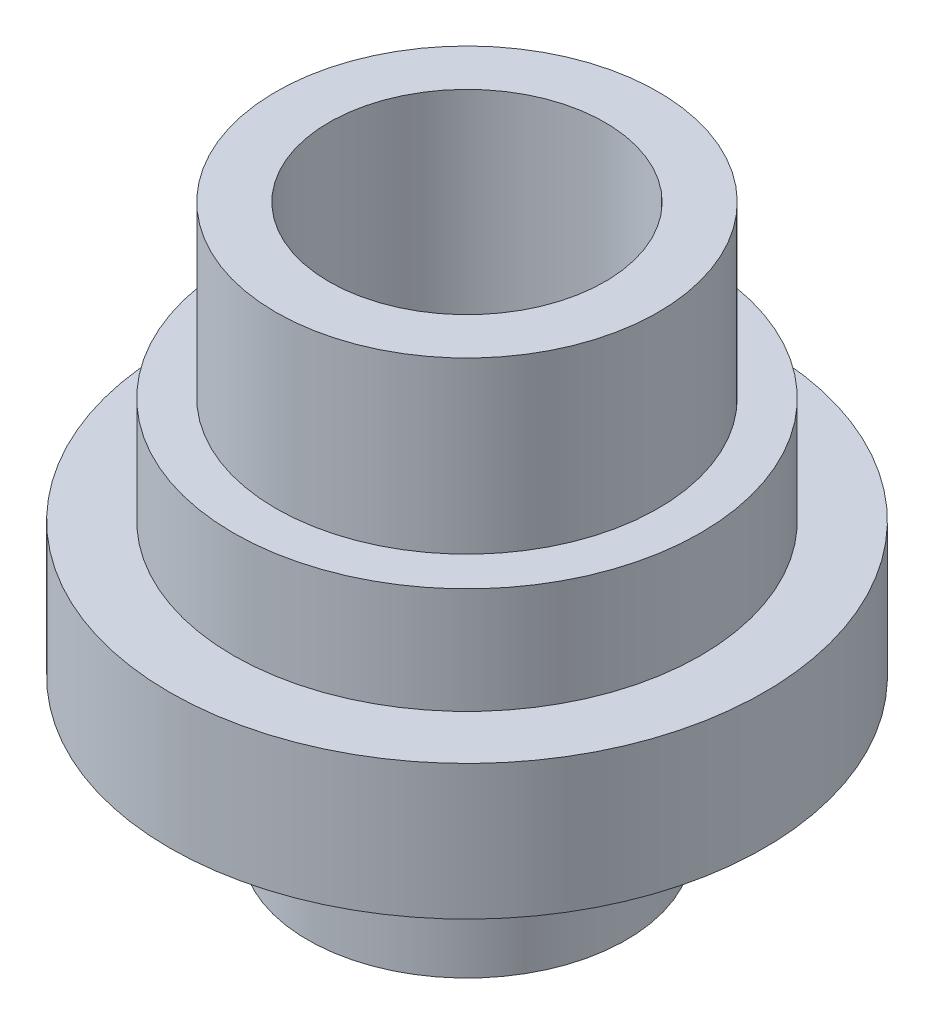
ISO-10303-21;
HEADER;
FILE_DESCRIPTION(('STEP AP214'),'2;1');
FILE_NAME('part.step','',(''),(''),'','','');
FILE_SCHEMA(('AUTOMOTIVE_DESIGN { 1 0 10303 214 1 1 1 1 }'));
ENDSEC;
DATA;
#1=APPLICATION_CONTEXT('core data for automotive mechanical design processes');
#2=APPLICATION_PROTOCOL_DEFINITION('international standard','automotive_design',2000,#1);
#3=PRODUCT_CONTEXT('',#1,'mechanical');
#4=PRODUCT('Part','Part','',(#3));
#5=PRODUCT_RELATED_PRODUCT_CATEGORY('part','',(#4));
#6=PRODUCT_DEFINITION_FORMATION('','',#4);
#7=PRODUCT_DEFINITION_CONTEXT('part definition',#1,'design');
#8=PRODUCT_DEFINITION('design','',#6,#7);
#9=PRODUCT_DEFINITION_SHAPE('','',#8);
#10=(LENGTH_UNIT() NAMED_UNIT(*) SI_UNIT(.MILLI.,.METRE.));
#11=(NAMED_UNIT(*) PLANE_ANGLE_UNIT() SI_UNIT($,.RADIAN.));
#12=(NAMED_UNIT(*) SI_UNIT($,.STERADIAN.) SOLID_ANGLE_UNIT());
#13=UNCERTAINTY_MEASURE_WITH_UNIT(LENGTH_MEASURE(1.E-05),#10,'distance_accuracy_value','');
#14=(GEOMETRIC_REPRESENTATION_CONTEXT(3) GLOBAL_UNCERTAINTY_ASSIGNED_CONTEXT((#13)) GLOBAL_UNIT_ASSIGNED_CONTEXT((#10,
#11,#12)) REPRESENTATION_CONTEXT('',''));
#15=CARTESIAN_POINT('',(0.,0.,0.));
#16=DIRECTION('',(0.,0.,1.));
#17=DIRECTION('',(1.,0.,0.));
#18=AXIS2_PLACEMENT_3D('',#15,#16,#17);
#19=CARTESIAN_POINT('',(0.,13.,0.));
#20=DIRECTION('',(0.,-1.,0.));
#21=DIRECTION('',(0.,0.,-1.));
#22=AXIS2_PLACEMENT_3D('',#19,#20,#21);
#23=CYLINDRICAL_SURFACE('',#22,1.25);
#24=CARTESIAN_POINT('',(0.,-6.35,0.));
#25=DIRECTION('',(0.,-1.,0.));
#26=DIRECTION('',(0.,0.,-1.));
#27=AXIS2_PLACEMENT_3D('',#24,#25,#26);
#28=CIRCLE('',#27,1.25);
#29=CARTESIAN_POINT('',(0.,-6.35,-1.25));
#30=VERTEX_POINT('',#29);
#31=EDGE_CURVE('E114',#30,#30,#28,.T.);
#32=ORIENTED_EDGE('',*,*,#31,.T.);
#33=EDGE_LOOP('',(#32));
#34=FACE_BOUND('',#33,.T.);
#35=CARTESIAN_POINT('',(0.,0.,0.));
#36=DIRECTION('',(0.,1.,0.));
#37=DIRECTION('',(0.,0.,1.));
#38=AXIS2_PLACEMENT_3D('',#35,#36,#37);
#39=CIRCLE('',#38,1.25);
#40=CARTESIAN_POINT('',(0.,0.,1.25));
#41=VERTEX_POINT('',#40);
#42=EDGE_CURVE('E160',#41,#41,#39,.F.);
#43=ORIENTED_EDGE('',*,*,#42,.F.);
#44=EDGE_LOOP('',(#43));
#45=FACE_BOUND('',#44,.T.);
#46=ADVANCED_FACE('F38',(#34,#45),#23,.F.);
#47=CARTESIAN_POINT('',(0.,-6.35,0.));
#48=DIRECTION('',(0.,-1.,0.));
#49=DIRECTION('',(0.,0.,-1.));
#50=AXIS2_PLACEMENT_3D('',#47,#48,#49);
#51=PLANE('',#50);
#52=CARTESIAN_POINT('',(0.,-6.35,0.));
#53=DIRECTION('',(0.,-1.,0.));
#54=DIRECTION('',(0.,0.,-1.));
#55=AXIS2_PLACEMENT_3D('',#52,#53,#54);
#56=CIRCLE('',#55,9.5);
#57=CARTESIAN_POINT('',(0.,-6.35,-9.5));
#58=VERTEX_POINT('',#57);
#59=EDGE_CURVE('E11',#58,#58,#56,.F.);
#60=ORIENTED_EDGE('',*,*,#59,.T.);
#61=EDGE_LOOP('',(#60));
#62=FACE_BOUND('',#61,.T.);
#63=CARTESIAN_POINT('',(0.,-6.35,0.));
#64=DIRECTION('',(0.,-1.,0.));
#65=DIRECTION('',(0.,0.,-1.));
#66=AXIS2_PLACEMENT_3D('',#63,#64,#65);
#67=CIRCLE('',#66,14.);
#68=CARTESIAN_POINT('',(0.,-6.35,-14.));
#69=VERTEX_POINT('',#68);
#70=EDGE_CURVE('E134',#69,#69,#67,.T.);
#71=ORIENTED_EDGE('',*,*,#70,.T.);
#72=EDGE_LOOP('',(#71));
#73=FACE_BOUND('',#72,.T.);
#74=ADVANCED_FACE('F182',(#62,#73),#51,.T.);
#75=CARTESIAN_POINT('',(0.,5.,0.));
#76=DIRECTION('',(0.,-1.,0.));
#77=DIRECTION('',(0.,0.,-1.));
#78=AXIS2_PLACEMENT_3D('',#75,#76,#77);
#79=CYLINDRICAL_SURFACE('',#78,11.);
#80=CARTESIAN_POINT('',(0.,5.,0.));
#81=DIRECTION('',(0.,1.,0.));
#82=DIRECTION('',(0.,0.,1.));
#83=AXIS2_PLACEMENT_3D('',#80,#81,#82);
#84=CIRCLE('',#83,11.);
#85=CARTESIAN_POINT('',(0.,5.,11.));
#86=VERTEX_POINT('',#85);
#87=EDGE_CURVE('E146',#86,#86,#84,.T.);
#88=ORIENTED_EDGE('',*,*,#87,.F.);
#89=EDGE_LOOP('',(#88));
#90=FACE_BOUND('',#89,.T.);
#91=CARTESIAN_POINT('',(0.,0.,0.));
#92=DIRECTION('',(0.,1.,0.));
#93=DIRECTION('',(0.,0.,1.));
#94=AXIS2_PLACEMENT_3D('',#91,#92,#93);
#95=CIRCLE('',#94,11.);
#96=CARTESIAN_POINT('',(0.,0.,11.));
#97=VERTEX_POINT('',#96);
#98=EDGE_CURVE('E138',#97,#97,#95,.T.);
#99=ORIENTED_EDGE('',*,*,#98,.T.);
#100=EDGE_LOOP('',(#99));
#101=FACE_BOUND('',#100,.T.);
#102=ADVANCED_FACE('F189',(#90,#101),#79,.T.);
#103=CARTESIAN_POINT('',(0.,5.,0.));
#104=DIRECTION('',(0.,1.,0.));
#105=DIRECTION('',(0.,0.,1.));
#106=AXIS2_PLACEMENT_3D('',#103,#104,#105);
#107=PLANE('',#106);
#108=CARTESIAN_POINT('',(0.,5.,0.));
#109=DIRECTION('',(0.,1.,0.));
#110=DIRECTION('',(0.,0.,1.));
#111=AXIS2_PLACEMENT_3D('',#108,#109,#110);
#112=CIRCLE('',#111,9.);
#113=CARTESIAN_POINT('',(0.,5.,9.));
#114=VERTEX_POINT('',#113);
#115=EDGE_CURVE('E147',#114,#114,#112,.T.);
#116=ORIENTED_EDGE('',*,*,#115,.F.);
#117=EDGE_LOOP('',(#116));
#118=FACE_BOUND('',#117,.T.);
#119=ORIENTED_EDGE('',*,*,#87,.T.);
#120=EDGE_LOOP('',(#119));
#121=FACE_BOUND('',#120,.T.);
#122=ADVANCED_FACE('F230',(#118,#121),#107,.T.);
#123=CARTESIAN_POINT('',(0.,13.,0.));
#124=DIRECTION('',(0.,-1.,0.));
#125=DIRECTION('',(0.,0.,-1.));
#126=AXIS2_PLACEMENT_3D('',#123,#124,#125);
#127=CYLINDRICAL_SURFACE('',#126,9.);
#128=CARTESIAN_POINT('',(0.,13.,0.));
#129=DIRECTION('',(0.,1.,0.));
#130=DIRECTION('',(0.,0.,1.));
#131=AXIS2_PLACEMENT_3D('',#128,#129,#130);
#132=CIRCLE('',#131,9.);
#133=CARTESIAN_POINT('',(0.,13.,9.));
#134=VERTEX_POINT('',#133);
#135=EDGE_CURVE('E142',#134,#134,#132,.T.);
#136=ORIENTED_EDGE('',*,*,#135,.F.);
#137=EDGE_LOOP('',(#136));
#138=FACE_BOUND('',#137,.T.);
#139=ORIENTED_EDGE('',*,*,#115,.T.);
#140=EDGE_LOOP('',(#139));
#141=FACE_BOUND('',#140,.T.);
#142=ADVANCED_FACE('F226',(#138,#141),#127,.T.);
#143=CARTESIAN_POINT('',(0.,13.,0.));
#144=DIRECTION('',(0.,1.,0.));
#145=DIRECTION('',(0.,0.,1.));
#146=AXIS2_PLACEMENT_3D('',#143,#144,#145);
#147=PLANE('',#146);
#148=CARTESIAN_POINT('',(0.,13.,0.));
#149=DIRECTION('',(0.,1.,0.));
#150=DIRECTION('',(0.,0.,1.));
#151=AXIS2_PLACEMENT_3D('',#148,#149,#150);
#152=CIRCLE('',#151,6.5);
#153=CARTESIAN_POINT('',(0.,13.,6.5));
#154=VERTEX_POINT('',#153);
#155=EDGE_CURVE('E335',#154,#154,#152,.T.);
#156=ORIENTED_EDGE('',*,*,#155,.F.);
#157=EDGE_LOOP('',(#156));
#158=FACE_BOUND('',#157,.T.);
#159=ORIENTED_EDGE('',*,*,#135,.T.);
#160=EDGE_LOOP('',(#159));
#161=FACE_BOUND('',#160,.T.);
#162=ADVANCED_FACE('F222',(#158,#161),#147,.T.);
#163=CARTESIAN_POINT('',(0.,-6.35,0.));
#164=DIRECTION('',(0.,1.,0.));
#165=DIRECTION('',(0.,0.,1.));
#166=AXIS2_PLACEMENT_3D('',#163,#164,#165);
#167=CYLINDRICAL_SURFACE('',#166,14.);
#168=ORIENTED_EDGE('',*,*,#70,.F.);
#169=EDGE_LOOP('',(#168));
#170=FACE_BOUND('',#169,.T.);
#171=CARTESIAN_POINT('',(0.,0.,0.));
#172=DIRECTION('',(0.,-1.,0.));
#173=DIRECTION('',(0.,0.,-1.));
#174=AXIS2_PLACEMENT_3D('',#171,#172,#173);
#175=CIRCLE('',#174,14.);
#176=CARTESIAN_POINT('',(0.,0.,-14.));
#177=VERTEX_POINT('',#176);
#178=EDGE_CURVE('E133',#177,#177,#175,.T.);
#179=ORIENTED_EDGE('',*,*,#178,.T.);
#180=EDGE_LOOP('',(#179));
#181=FACE_BOUND('',#180,.T.);
#182=ADVANCED_FACE('F218',(#170,#181),#167,.T.);
#183=CARTESIAN_POINT('',(0.,0.,0.));
#184=DIRECTION('',(0.,-1.,0.));
#185=DIRECTION('',(0.,0.,-1.));
#186=AXIS2_PLACEMENT_3D('',#183,#184,#185);
#187=PLANE('',#186);
#188=ORIENTED_EDGE('',*,*,#98,.F.);
#189=EDGE_LOOP('',(#188));
#190=FACE_BOUND('',#189,.T.);
#191=ORIENTED_EDGE('',*,*,#178,.F.);
#192=EDGE_LOOP('',(#191));
#193=FACE_BOUND('',#192,.T.);
#194=ADVANCED_FACE('F210',(#190,#193),#187,.F.);
#195=CARTESIAN_POINT('',(0.,-13.35,0.));
#196=DIRECTION('',(0.,-1.,0.));
#197=DIRECTION('',(0.,0.,-1.));
#198=AXIS2_PLACEMENT_3D('',#195,#196,#197);
#199=PLANE('',#198);
#200=CARTESIAN_POINT('',(0.,-13.35,0.));
#201=DIRECTION('',(0.,-1.,0.));
#202=DIRECTION('',(0.,0.,-1.));
#203=AXIS2_PLACEMENT_3D('',#200,#201,#202);
#204=CIRCLE('',#203,7.5);
#205=CARTESIAN_POINT('',(0.,-13.35,-7.5));
#206=VERTEX_POINT('',#205);
#207=EDGE_CURVE('E96',#206,#206,#204,.T.);
#208=ORIENTED_EDGE('',*,*,#207,.T.);
#209=EDGE_LOOP('',(#208));
#210=FACE_BOUND('',#209,.T.);
#211=DIRECTION('',(0.,0.,-1.));
#212=VECTOR('',#211,1.);
#213=CARTESIAN_POINT('',(-1.775,-13.35,-2.0345454037696));
#214=LINE('',#213,#212);
#215=CARTESIAN_POINT('',(-1.775,-13.35,2.0345454037696));
#216=VERTEX_POINT('',#215);
#217=CARTESIAN_POINT('',(-1.775,-13.35,-2.0345454037696));
#218=VERTEX_POINT('',#217);
#219=EDGE_CURVE('E89',#216,#218,#214,.T.);
#220=ORIENTED_EDGE('',*,*,#219,.F.);
#221=CARTESIAN_POINT('',(0.,-13.35,0.));
#222=DIRECTION('',(0.,-1.,0.));
#223=DIRECTION('',(0.,0.,-1.));
#224=AXIS2_PLACEMENT_3D('',#221,#222,#223);
#225=CIRCLE('',#224,2.7);
#226=CARTESIAN_POINT('',(1.775,-13.35,2.0345454037696));
#227=VERTEX_POINT('',#226);
#228=EDGE_CURVE('E79',#227,#216,#225,.T.);
#229=ORIENTED_EDGE('',*,*,#228,.F.);
#230=DIRECTION('',(0.,0.,1.));
#231=VECTOR('',#230,1.);
#232=CARTESIAN_POINT('',(1.775,-13.35,-2.0345454037696));
#233=LINE('',#232,#231);
#234=CARTESIAN_POINT('',(1.775,-13.35,-2.0345454037696));
#235=VERTEX_POINT('',#234);
#236=EDGE_CURVE('E106',#235,#227,#233,.T.);
#237=ORIENTED_EDGE('',*,*,#236,.F.);
#238=CARTESIAN_POINT('',(0.,-13.35,0.));
#239=DIRECTION('',(0.,-1.,0.));
#240=DIRECTION('',(0.,0.,-1.));
#241=AXIS2_PLACEMENT_3D('',#238,#239,#240);
#242=CIRCLE('',#241,2.7);
#243=EDGE_CURVE('E102',#218,#235,#242,.T.);
#244=ORIENTED_EDGE('',*,*,#243,.F.);
#245=EDGE_LOOP('',(#220,#229,#237,#244));
#246=FACE_BOUND('',#245,.T.);
#247=ADVANCED_FACE('F100',(#210,#246),#199,.T.);
#248=CARTESIAN_POINT('',(0.,-13.35,0.));
#249=DIRECTION('',(0.,1.,0.));
#250=DIRECTION('',(0.,0.,1.));
#251=AXIS2_PLACEMENT_3D('',#248,#249,#250);
#252=CYLINDRICAL_SURFACE('',#251,7.5);
#253=CARTESIAN_POINT('',(0.,-8.35,0.));
#254=DIRECTION('',(0.,-1.,0.));
#255=DIRECTION('',(0.,0.,-1.));
#256=AXIS2_PLACEMENT_3D('',#253,#254,#255);
#257=CIRCLE('',#256,7.5);
#258=CARTESIAN_POINT('',(0.,-8.35,-7.5));
#259=VERTEX_POINT('',#258);
#260=EDGE_CURVE('E47',#259,#259,#257,.T.);
#261=ORIENTED_EDGE('',*,*,#260,.T.);
#262=EDGE_LOOP('',(#261));
#263=FACE_BOUND('',#262,.T.);
#264=ORIENTED_EDGE('',*,*,#207,.F.);
#265=EDGE_LOOP('',(#264));
#266=FACE_BOUND('',#265,.T.);
#267=ADVANCED_FACE('F168',(#263,#266),#252,.T.);
#268=CARTESIAN_POINT('',(0.,-13.35,0.));
#269=DIRECTION('',(0.,1.,0.));
#270=DIRECTION('',(0.,0.,1.));
#271=AXIS2_PLACEMENT_3D('',#268,#269,#270);
#272=CYLINDRICAL_SURFACE('',#271,2.7);
#273=CARTESIAN_POINT('',(0.,-6.35,0.));
#274=DIRECTION('',(0.,-1.,0.));
#275=DIRECTION('',(0.,0.,-1.));
#276=AXIS2_PLACEMENT_3D('',#273,#274,#275);
#277=CIRCLE('',#276,2.7);
#278=CARTESIAN_POINT('',(1.775,-6.35,2.0345454037696));
#279=VERTEX_POINT('',#278);
#280=CARTESIAN_POINT('',(-1.775,-6.35,2.0345454037696));
#281=VERTEX_POINT('',#280);
#282=EDGE_CURVE('E54',#279,#281,#277,.T.);
#283=ORIENTED_EDGE('',*,*,#282,.F.);
#284=DIRECTION('',(0.,1.,0.));
#285=VECTOR('',#284,1.);
#286=CARTESIAN_POINT('',(1.775,-13.35,2.0345454037696));
#287=LINE('',#286,#285);
#288=EDGE_CURVE('E84',#227,#279,#287,.T.);
#289=ORIENTED_EDGE('',*,*,#288,.F.);
#290=ORIENTED_EDGE('',*,*,#228,.T.);
#291=DIRECTION('',(0.,1.,0.));
#292=VECTOR('',#291,1.);
#293=CARTESIAN_POINT('',(-1.775,-13.35,2.0345454037696));
#294=LINE('',#293,#292);
#295=EDGE_CURVE('E82',#216,#281,#294,.T.);
#296=ORIENTED_EDGE('',*,*,#295,.T.);
#297=EDGE_LOOP('',(#283,#289,#290,#296));
#298=FACE_BOUND('',#297,.T.);
#299=ADVANCED_FACE('F81',(#298),#272,.F.);
#300=CARTESIAN_POINT('',(-1.775,-13.35,-2.0345454037696));
#301=DIRECTION('',(1.,0.,0.));
#302=DIRECTION('',(0.,0.,-1.));
#303=AXIS2_PLACEMENT_3D('',#300,#301,#302);
#304=PLANE('',#303);
#305=DIRECTION('',(0.,0.,-1.));
#306=VECTOR('',#305,1.);
#307=CARTESIAN_POINT('',(-1.775,-6.35,-2.0345454037696));
#308=LINE('',#307,#306);
#309=CARTESIAN_POINT('',(-1.775,-6.35,-2.0345454037696));
#310=VERTEX_POINT('',#309);
#311=EDGE_CURVE('E58',#281,#310,#308,.T.);
#312=ORIENTED_EDGE('',*,*,#311,.F.);
#313=ORIENTED_EDGE('',*,*,#295,.F.);
#314=ORIENTED_EDGE('',*,*,#219,.T.);
#315=DIRECTION('',(0.,1.,0.));
#316=VECTOR('',#315,1.);
#317=CARTESIAN_POINT('',(-1.775,-13.35,-2.0345454037696));
#318=LINE('',#317,#316);
#319=EDGE_CURVE('E97',#218,#310,#318,.T.);
#320=ORIENTED_EDGE('',*,*,#319,.T.);
#321=EDGE_LOOP('',(#312,#313,#314,#320));
#322=FACE_BOUND('',#321,.T.);
#323=ADVANCED_FACE('F93',(#322),#304,.T.);
#324=CARTESIAN_POINT('',(0.,-13.35,0.));
#325=DIRECTION('',(0.,1.,0.));
#326=DIRECTION('',(0.,0.,1.));
#327=AXIS2_PLACEMENT_3D('',#324,#325,#326);
#328=CYLINDRICAL_SURFACE('',#327,2.7);
#329=CARTESIAN_POINT('',(0.,-6.35,0.));
#330=DIRECTION('',(0.,-1.,0.));
#331=DIRECTION('',(0.,0.,-1.));
#332=AXIS2_PLACEMENT_3D('',#329,#330,#331);
#333=CIRCLE('',#332,2.7);
#334=CARTESIAN_POINT('',(1.775,-6.35,-2.0345454037696));
#335=VERTEX_POINT('',#334);
#336=EDGE_CURVE('E117',#310,#335,#333,.T.);
#337=ORIENTED_EDGE('',*,*,#336,.F.);
#338=ORIENTED_EDGE('',*,*,#319,.F.);
#339=ORIENTED_EDGE('',*,*,#243,.T.);
#340=DIRECTION('',(0.,1.,0.));
#341=VECTOR('',#340,1.);
#342=CARTESIAN_POINT('',(1.775,-13.35,-2.0345454037696));
#343=LINE('',#342,#341);
#344=EDGE_CURVE('E124',#235,#335,#343,.T.);
#345=ORIENTED_EDGE('',*,*,#344,.T.);
#346=EDGE_LOOP('',(#337,#338,#339,#345));
#347=FACE_BOUND('',#346,.T.);
#348=ADVANCED_FACE('F199',(#347),#328,.F.);
#349=CARTESIAN_POINT('',(1.775,-13.35,-2.0345454037696));
#350=DIRECTION('',(-1.,0.,0.));
#351=DIRECTION('',(0.,0.,1.));
#352=AXIS2_PLACEMENT_3D('',#349,#350,#351);
#353=PLANE('',#352);
#354=DIRECTION('',(0.,0.,1.));
#355=VECTOR('',#354,1.);
#356=CARTESIAN_POINT('',(1.775,-6.35,-2.0345454037696));
#357=LINE('',#356,#355);
#358=EDGE_CURVE('E90',#335,#279,#357,.T.);
#359=ORIENTED_EDGE('',*,*,#358,.F.);
#360=ORIENTED_EDGE('',*,*,#344,.F.);
#361=ORIENTED_EDGE('',*,*,#236,.T.);
#362=ORIENTED_EDGE('',*,*,#288,.T.);
#363=EDGE_LOOP('',(#359,#360,#361,#362));
#364=FACE_BOUND('',#363,.T.);
#365=ADVANCED_FACE('F196',(#364),#353,.T.);
#366=ORIENTED_EDGE('',*,*,#31,.F.);
#367=EDGE_LOOP('',(#366));
#368=FACE_BOUND('',#367,.T.);
#369=ORIENTED_EDGE('',*,*,#282,.T.);
#370=ORIENTED_EDGE('',*,*,#311,.T.);
#371=ORIENTED_EDGE('',*,*,#336,.T.);
#372=ORIENTED_EDGE('',*,*,#358,.T.);
#373=EDGE_LOOP('',(#369,#370,#371,#372));
#374=FACE_BOUND('',#373,.T.);
#375=ADVANCED_FACE('F192',(#368,#374),#51,.T.);
#376=CARTESIAN_POINT('',(0.,0.,0.));
#377=DIRECTION('',(0.,1.,0.));
#378=DIRECTION('',(0.,0.,1.));
#379=AXIS2_PLACEMENT_3D('',#376,#377,#378);
#380=PLANE('',#379);
#381=CARTESIAN_POINT('',(0.,0.,0.));
#382=DIRECTION('',(0.,1.,0.));
#383=DIRECTION('',(0.,0.,1.));
#384=AXIS2_PLACEMENT_3D('',#381,#382,#383);
#385=CIRCLE('',#384,6.5);
#386=CARTESIAN_POINT('',(0.,0.,6.5));
#387=VERTEX_POINT('',#386);
#388=EDGE_CURVE('E163',#387,#387,#385,.T.);
#389=ORIENTED_EDGE('',*,*,#388,.T.);
#390=EDGE_LOOP('',(#389));
#391=FACE_BOUND('',#390,.T.);
#392=ORIENTED_EDGE('',*,*,#42,.T.);
#393=EDGE_LOOP('',(#392));
#394=FACE_BOUND('',#393,.T.);
#395=ADVANCED_FACE('F177',(#391,#394),#380,.T.);
#396=CARTESIAN_POINT('',(0.,0.,0.));
#397=DIRECTION('',(0.,1.,0.));
#398=DIRECTION('',(0.,0.,1.));
#399=AXIS2_PLACEMENT_3D('',#396,#397,#398);
#400=CYLINDRICAL_SURFACE('',#399,6.5);
#401=CARTESIAN_POINT('',(0.,0.,6.5));
#402=CARTESIAN_POINT('',(0.,0.135416666666668,6.5));
#403=CARTESIAN_POINT('',(0.,0.270833333333335,6.5));
#404=CARTESIAN_POINT('',(0.,0.541666666666668,6.5));
#405=CARTESIAN_POINT('',(0.,0.677083333333335,6.5));
#406=CARTESIAN_POINT('',(0.,0.947916666666668,6.5));
#407=CARTESIAN_POINT('',(0.,1.08333333333334,6.5));
#408=CARTESIAN_POINT('',(0.,1.35416666666667,6.5));
#409=CARTESIAN_POINT('',(0.,1.48958333333334,6.5));
#410=CARTESIAN_POINT('',(0.,1.76041666666667,6.5));
#411=CARTESIAN_POINT('',(0.,1.89583333333333,6.5));
#412=CARTESIAN_POINT('',(0.,2.16666666666667,6.5));
#413=CARTESIAN_POINT('',(0.,2.30208333333333,6.5));
#414=CARTESIAN_POINT('',(0.,2.57291666666667,6.5));
#415=CARTESIAN_POINT('',(0.,2.70833333333334,6.5));
#416=CARTESIAN_POINT('',(0.,2.97916666666667,6.5));
#417=CARTESIAN_POINT('',(0.,3.11458333333334,6.5));
#418=CARTESIAN_POINT('',(0.,3.38541666666667,6.5));
#419=CARTESIAN_POINT('',(0.,3.52083333333333,6.5));
#420=CARTESIAN_POINT('',(0.,3.79166666666667,6.5));
#421=CARTESIAN_POINT('',(0.,3.92708333333333,6.5));
#422=CARTESIAN_POINT('',(0.,4.19791666666667,6.5));
#423=CARTESIAN_POINT('',(0.,4.33333333333333,6.5));
#424=CARTESIAN_POINT('',(0.,4.60416666666667,6.5));
#425=CARTESIAN_POINT('',(0.,4.73958333333333,6.5));
#426=CARTESIAN_POINT('',(0.,5.01041666666667,6.5));
#427=CARTESIAN_POINT('',(0.,5.14583333333333,6.5));
#428=CARTESIAN_POINT('',(0.,5.41666666666667,6.5));
#429=CARTESIAN_POINT('',(0.,5.55208333333333,6.5));
#430=CARTESIAN_POINT('',(0.,5.82291666666667,6.5));
#431=CARTESIAN_POINT('',(0.,5.95833333333333,6.5));
#432=CARTESIAN_POINT('',(0.,6.22916666666667,6.5));
#433=CARTESIAN_POINT('',(0.,6.36458333333333,6.5));
#434=CARTESIAN_POINT('',(0.,6.63541666666667,6.5));
#435=CARTESIAN_POINT('',(0.,6.77083333333334,6.5));
#436=CARTESIAN_POINT('',(0.,7.04166666666667,6.5));
#437=CARTESIAN_POINT('',(0.,7.17708333333333,6.5));
#438=CARTESIAN_POINT('',(0.,7.44791666666667,6.5));
#439=CARTESIAN_POINT('',(0.,7.58333333333333,6.5));
#440=CARTESIAN_POINT('',(0.,7.85416666666667,6.5));
#441=CARTESIAN_POINT('',(0.,7.98958333333333,6.5));
#442=CARTESIAN_POINT('',(0.,8.26041666666667,6.5));
#443=CARTESIAN_POINT('',(0.,8.39583333333333,6.5));
#444=CARTESIAN_POINT('',(0.,8.66666666666667,6.5));
#445=CARTESIAN_POINT('',(0.,8.80208333333333,6.5));
#446=CARTESIAN_POINT('',(0.,9.07291666666667,6.5));
#447=CARTESIAN_POINT('',(0.,9.20833333333333,6.5));
#448=CARTESIAN_POINT('',(0.,9.47916666666667,6.5));
#449=CARTESIAN_POINT('',(0.,9.61458333333333,6.5));
#450=CARTESIAN_POINT('',(0.,9.88541666666667,6.5));
#451=CARTESIAN_POINT('',(0.,10.0208333333333,6.5));
#452=CARTESIAN_POINT('',(0.,10.2916666666667,6.5));
#453=CARTESIAN_POINT('',(0.,10.4270833333333,6.5));
#454=CARTESIAN_POINT('',(0.,10.6979166666667,6.5));
#455=CARTESIAN_POINT('',(0.,10.8333333333333,6.5));
#456=CARTESIAN_POINT('',(0.,11.1041666666667,6.5));
#457=CARTESIAN_POINT('',(0.,11.2395833333333,6.5));
#458=CARTESIAN_POINT('',(0.,11.5104166666667,6.5));
#459=CARTESIAN_POINT('',(0.,11.6458333333333,6.5));
#460=CARTESIAN_POINT('',(0.,11.9166666666667,6.5));
#461=CARTESIAN_POINT('',(0.,12.0520833333333,6.5));
#462=CARTESIAN_POINT('',(0.,12.3229166666667,6.5));
#463=CARTESIAN_POINT('',(0.,12.4583333333333,6.5));
#464=CARTESIAN_POINT('',(0.,12.7291666666667,6.5));
#465=CARTESIAN_POINT('',(0.,12.8645833333333,6.5));
#466=CARTESIAN_POINT('',(0.,13.,6.5));
#467=B_SPLINE_CURVE_WITH_KNOTS('',3,(#401,#402,#403,#404,#405,#406,#407,#408,#409,#410,#411,
#412,#413,#414,#415,#416,#417,#418,#419,#420,#421,#422,#423,#424,#425,#426,#427,#428,#429,#430,
#431,#432,#433,#434,#435,#436,#437,#438,#439,#440,#441,#442,#443,#444,#445,#446,#447,#448,#449,
#450,#451,#452,#453,#454,#455,#456,#457,#458,#459,#460,#461,#462,#463,#464,#465,#466),
.UNSPECIFIED.,.F.,.F.,(4,2,2,2,2,2,2,2,2,2,2,2,2,2,2,2,2,2,2,2,2,2,2,2,2,2,2,2,2,2,2,2,4),(0.,
0.40625,0.8125,1.21875,1.625,2.03125,2.4375,2.84375,3.25,3.65625,4.0625,4.46875,4.875,5.28125,
5.6875,6.09375,6.5,6.90625,7.3125,7.71875,8.125,8.53125,8.9375,9.34375,9.75,10.15625,10.5625,
10.96875,11.375,11.78125,12.1875,12.59375,13.),.UNSPECIFIED.);
#468=EDGE_CURVE('BSEAM172',#387,#154,#467,.T.);
#469=ORIENTED_EDGE('',*,*,#388,.F.);
#470=ORIENTED_EDGE('',*,*,#155,.T.);
#471=ORIENTED_EDGE('',*,*,#468,.T.);
#472=ORIENTED_EDGE('',*,*,#468,.F.);
#473=EDGE_LOOP('',(#469,#471,#470,#472));
#474=FACE_BOUND('',#473,.T.);
#475=ADVANCED_FACE('F172',(#474),#400,.F.);
#476=CARTESIAN_POINT('',(0.,-8.35,0.));
#477=DIRECTION('',(0.,-1.,0.));
#478=DIRECTION('',(0.,0.,-1.));
#479=AXIS2_PLACEMENT_3D('',#476,#477,#478);
#480=TOROIDAL_SURFACE('',#479,9.5,2.);
#481=ORIENTED_EDGE('',*,*,#59,.F.);
#482=EDGE_LOOP('',(#481));
#483=FACE_BOUND('',#482,.T.);
#484=ORIENTED_EDGE('',*,*,#260,.F.);
#485=EDGE_LOOP('',(#484));
#486=FACE_BOUND('',#485,.T.);
#487=ADVANCED_FACE('F40',(#483,#486),#480,.F.);
#488=CLOSED_SHELL('',(#46,#74,#102,#122,#142,#162,#182,#194,#247,#267,#299,#323,#348,#365,#375,
#395,#475,#487));
#489=MANIFOLD_SOLID_BREP('B2',#488);
#490=ADVANCED_BREP_SHAPE_REPRESENTATION('',(#18,#489),#14);
#491=SHAPE_DEFINITION_REPRESENTATION(#9,#490);
ENDSEC;
END-ISO-10303-21;
